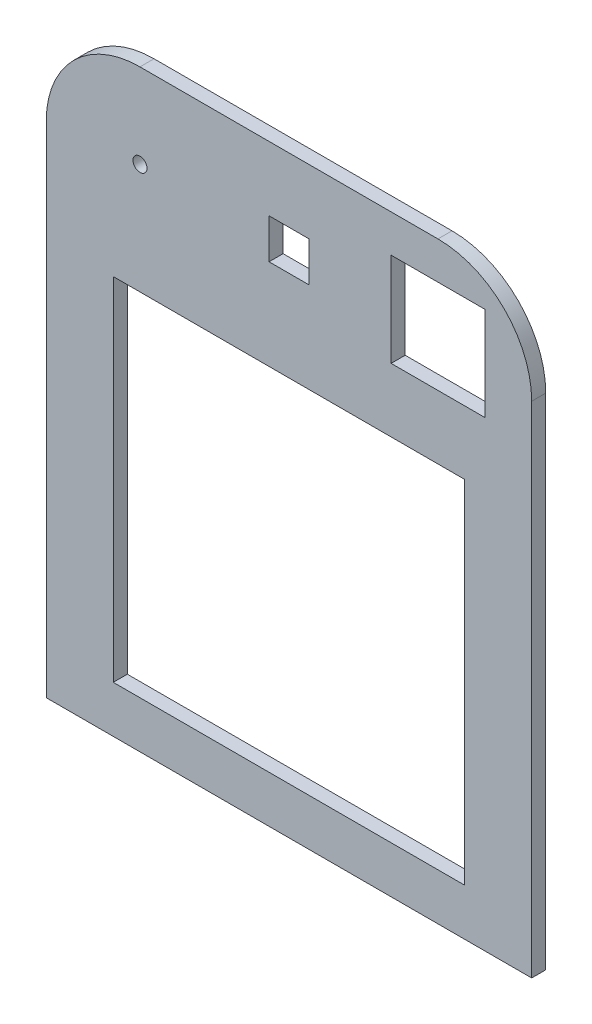
ISO-10303-21;
HEADER;
FILE_DESCRIPTION(('STEP AP214'),'2;1');
FILE_NAME('part.step','',(''),(''),'','','');
FILE_SCHEMA(('AUTOMOTIVE_DESIGN { 1 0 10303 214 1 1 1 1 }'));
ENDSEC;
DATA;
#1=APPLICATION_CONTEXT('core data for automotive mechanical design processes');
#2=APPLICATION_PROTOCOL_DEFINITION('international standard','automotive_design',2000,#1);
#3=PRODUCT_CONTEXT('',#1,'mechanical');
#4=PRODUCT('Part','Part','',(#3));
#5=PRODUCT_RELATED_PRODUCT_CATEGORY('part','',(#4));
#6=PRODUCT_DEFINITION_FORMATION('','',#4);
#7=PRODUCT_DEFINITION_CONTEXT('part definition',#1,'design');
#8=PRODUCT_DEFINITION('design','',#6,#7);
#9=PRODUCT_DEFINITION_SHAPE('','',#8);
#10=(LENGTH_UNIT() NAMED_UNIT(*) SI_UNIT(.MILLI.,.METRE.));
#11=(NAMED_UNIT(*) PLANE_ANGLE_UNIT() SI_UNIT($,.RADIAN.));
#12=(NAMED_UNIT(*) SI_UNIT($,.STERADIAN.) SOLID_ANGLE_UNIT());
#13=UNCERTAINTY_MEASURE_WITH_UNIT(LENGTH_MEASURE(1.E-05),#10,'distance_accuracy_value','');
#14=(GEOMETRIC_REPRESENTATION_CONTEXT(3) GLOBAL_UNCERTAINTY_ASSIGNED_CONTEXT((#13)) GLOBAL_UNIT_ASSIGNED_CONTEXT((#10,
#11,#12)) REPRESENTATION_CONTEXT('',''));
#15=CARTESIAN_POINT('',(0.,0.,0.));
#16=DIRECTION('',(0.,0.,1.));
#17=DIRECTION('',(1.,0.,0.));
#18=AXIS2_PLACEMENT_3D('',#15,#16,#17);
#19=CARTESIAN_POINT('',(51.8,63.3,3.));
#20=DIRECTION('',(-1.,0.,0.));
#21=DIRECTION('',(0.,-1.,0.));
#22=AXIS2_PLACEMENT_3D('',#19,#20,#21);
#23=PLANE('',#22);
#24=DIRECTION('',(0.,1.,0.));
#25=VECTOR('',#24,1.);
#26=CARTESIAN_POINT('',(51.8,63.3,0.));
#27=LINE('',#26,#25);
#28=CARTESIAN_POINT('',(51.8,-63.3,0.));
#29=VERTEX_POINT('',#28);
#30=CARTESIAN_POINT('',(51.8,43.3,0.));
#31=VERTEX_POINT('',#30);
#32=EDGE_CURVE('E203',#29,#31,#27,.T.);
#33=ORIENTED_EDGE('',*,*,#32,.T.);
#34=DIRECTION('',(0.,0.,-1.));
#35=VECTOR('',#34,1.);
#36=CARTESIAN_POINT('',(51.8,43.3,3.));
#37=LINE('',#36,#35);
#38=CARTESIAN_POINT('',(51.8,43.3,3.));
#39=VERTEX_POINT('',#38);
#40=EDGE_CURVE('E304',#31,#39,#37,.F.);
#41=ORIENTED_EDGE('',*,*,#40,.T.);
#42=DIRECTION('',(0.,1.,0.));
#43=VECTOR('',#42,1.);
#44=CARTESIAN_POINT('',(51.8,63.3,3.));
#45=LINE('',#44,#43);
#46=CARTESIAN_POINT('',(51.8,-63.3,3.));
#47=VERTEX_POINT('',#46);
#48=EDGE_CURVE('E276',#47,#39,#45,.T.);
#49=ORIENTED_EDGE('',*,*,#48,.F.);
#50=DIRECTION('',(0.,0.,-1.));
#51=VECTOR('',#50,1.);
#52=CARTESIAN_POINT('',(51.8,-63.3,3.));
#53=LINE('',#52,#51);
#54=EDGE_CURVE('E286',#47,#29,#53,.T.);
#55=ORIENTED_EDGE('',*,*,#54,.T.);
#56=EDGE_LOOP('',(#33,#41,#49,#55));
#57=FACE_BOUND('',#56,.T.);
#58=ADVANCED_FACE('F37',(#57),#23,.F.);
#59=CARTESIAN_POINT('',(-51.8,63.3,3.));
#60=DIRECTION('',(0.,-1.,0.));
#61=DIRECTION('',(0.,0.,-1.));
#62=AXIS2_PLACEMENT_3D('',#59,#60,#61);
#63=PLANE('',#62);
#64=DIRECTION('',(-1.,0.,0.));
#65=VECTOR('',#64,1.);
#66=CARTESIAN_POINT('',(-51.8,63.3,0.));
#67=LINE('',#66,#65);
#68=CARTESIAN_POINT('',(31.8,63.3,0.));
#69=VERTEX_POINT('',#68);
#70=CARTESIAN_POINT('',(-31.8,63.3,0.));
#71=VERTEX_POINT('',#70);
#72=EDGE_CURVE('E289',#69,#71,#67,.T.);
#73=ORIENTED_EDGE('',*,*,#72,.T.);
#74=DIRECTION('',(0.,0.,-1.));
#75=VECTOR('',#74,1.);
#76=CARTESIAN_POINT('',(-31.8,63.3,3.));
#77=LINE('',#76,#75);
#78=CARTESIAN_POINT('',(-31.8,63.3,3.));
#79=VERTEX_POINT('',#78);
#80=EDGE_CURVE('E45',#71,#79,#77,.F.);
#81=ORIENTED_EDGE('',*,*,#80,.T.);
#82=DIRECTION('',(-1.,0.,0.));
#83=VECTOR('',#82,1.);
#84=CARTESIAN_POINT('',(-51.8,63.3,3.));
#85=LINE('',#84,#83);
#86=CARTESIAN_POINT('',(31.8,63.3,3.));
#87=VERTEX_POINT('',#86);
#88=EDGE_CURVE('E279',#87,#79,#85,.T.);
#89=ORIENTED_EDGE('',*,*,#88,.F.);
#90=DIRECTION('',(0.,0.,-1.));
#91=VECTOR('',#90,1.);
#92=CARTESIAN_POINT('',(31.8,63.3,3.));
#93=LINE('',#92,#91);
#94=EDGE_CURVE('E299',#87,#69,#93,.T.);
#95=ORIENTED_EDGE('',*,*,#94,.T.);
#96=EDGE_LOOP('',(#73,#81,#89,#95));
#97=FACE_BOUND('',#96,.T.);
#98=ADVANCED_FACE('F333',(#97),#63,.F.);
#99=CARTESIAN_POINT('',(-51.8,63.3,3.));
#100=DIRECTION('',(1.,0.,0.));
#101=DIRECTION('',(0.,1.,0.));
#102=AXIS2_PLACEMENT_3D('',#99,#100,#101);
#103=PLANE('',#102);
#104=DIRECTION('',(0.,-1.,0.));
#105=VECTOR('',#104,1.);
#106=CARTESIAN_POINT('',(-51.8,63.3,3.));
#107=LINE('',#106,#105);
#108=CARTESIAN_POINT('',(-51.8,43.3,3.));
#109=VERTEX_POINT('',#108);
#110=CARTESIAN_POINT('',(-51.8,-63.3,3.));
#111=VERTEX_POINT('',#110);
#112=EDGE_CURVE('E282',#109,#111,#107,.T.);
#113=ORIENTED_EDGE('',*,*,#112,.F.);
#114=DIRECTION('',(0.,0.,-1.));
#115=VECTOR('',#114,1.);
#116=CARTESIAN_POINT('',(-51.8,43.3,3.));
#117=LINE('',#116,#115);
#118=CARTESIAN_POINT('',(-51.8,43.3,0.));
#119=VERTEX_POINT('',#118);
#120=EDGE_CURVE('E308',#109,#119,#117,.T.);
#121=ORIENTED_EDGE('',*,*,#120,.T.);
#122=DIRECTION('',(0.,-1.,0.));
#123=VECTOR('',#122,1.);
#124=CARTESIAN_POINT('',(-51.8,63.3,0.));
#125=LINE('',#124,#123);
#126=CARTESIAN_POINT('',(-51.8,-63.3,0.));
#127=VERTEX_POINT('',#126);
#128=EDGE_CURVE('E291',#119,#127,#125,.T.);
#129=ORIENTED_EDGE('',*,*,#128,.T.);
#130=DIRECTION('',(0.,0.,-1.));
#131=VECTOR('',#130,1.);
#132=CARTESIAN_POINT('',(-51.8,-63.3,3.));
#133=LINE('',#132,#131);
#134=EDGE_CURVE('E296',#111,#127,#133,.T.);
#135=ORIENTED_EDGE('',*,*,#134,.F.);
#136=EDGE_LOOP('',(#113,#121,#129,#135));
#137=FACE_BOUND('',#136,.T.);
#138=ADVANCED_FACE('F314',(#137),#103,.F.);
#139=CARTESIAN_POINT('',(-51.8,-63.3,3.));
#140=DIRECTION('',(0.,1.,0.));
#141=DIRECTION('',(0.,0.,1.));
#142=AXIS2_PLACEMENT_3D('',#139,#140,#141);
#143=PLANE('',#142);
#144=DIRECTION('',(1.,0.,0.));
#145=VECTOR('',#144,1.);
#146=CARTESIAN_POINT('',(-51.8,-63.3,0.));
#147=LINE('',#146,#145);
#148=EDGE_CURVE('E280',#127,#29,#147,.T.);
#149=ORIENTED_EDGE('',*,*,#148,.T.);
#150=ORIENTED_EDGE('',*,*,#54,.F.);
#151=DIRECTION('',(1.,0.,0.));
#152=VECTOR('',#151,1.);
#153=CARTESIAN_POINT('',(-51.8,-63.3,3.));
#154=LINE('',#153,#152);
#155=EDGE_CURVE('E284',#111,#47,#154,.T.);
#156=ORIENTED_EDGE('',*,*,#155,.F.);
#157=ORIENTED_EDGE('',*,*,#134,.T.);
#158=EDGE_LOOP('',(#149,#150,#156,#157));
#159=FACE_BOUND('',#158,.T.);
#160=ADVANCED_FACE('F322',(#159),#143,.F.);
#161=CARTESIAN_POINT('',(0.,0.,3.));
#162=DIRECTION('',(0.,0.,1.));
#163=DIRECTION('',(1.,0.,0.));
#164=AXIS2_PLACEMENT_3D('',#161,#162,#163);
#165=PLANE('',#164);
#166=DIRECTION('',(-1.,0.,0.));
#167=VECTOR('',#166,1.);
#168=CARTESIAN_POINT('',(37.5,21.7,3.));
#169=LINE('',#168,#167);
#170=CARTESIAN_POINT('',(37.5,21.7,3.));
#171=VERTEX_POINT('',#170);
#172=CARTESIAN_POINT('',(-37.5,21.7,3.));
#173=VERTEX_POINT('',#172);
#174=EDGE_CURVE('E169',#171,#173,#169,.T.);
#175=ORIENTED_EDGE('',*,*,#174,.F.);
#176=DIRECTION('',(0.,1.,0.));
#177=VECTOR('',#176,1.);
#178=CARTESIAN_POINT('',(37.5,-53.3,3.));
#179=LINE('',#178,#177);
#180=CARTESIAN_POINT('',(37.5,-53.3,3.));
#181=VERTEX_POINT('',#180);
#182=EDGE_CURVE('E187',#181,#171,#179,.T.);
#183=ORIENTED_EDGE('',*,*,#182,.F.);
#184=DIRECTION('',(1.,0.,0.));
#185=VECTOR('',#184,1.);
#186=CARTESIAN_POINT('',(-37.5,-53.3,3.));
#187=LINE('',#186,#185);
#188=CARTESIAN_POINT('',(-37.5,-53.3,3.));
#189=VERTEX_POINT('',#188);
#190=EDGE_CURVE('E190',#189,#181,#187,.T.);
#191=ORIENTED_EDGE('',*,*,#190,.F.);
#192=DIRECTION('',(0.,-1.,0.));
#193=VECTOR('',#192,1.);
#194=CARTESIAN_POINT('',(-37.5,21.7,3.));
#195=LINE('',#194,#193);
#196=EDGE_CURVE('E196',#173,#189,#195,.T.);
#197=ORIENTED_EDGE('',*,*,#196,.F.);
#198=EDGE_LOOP('',(#175,#183,#191,#197));
#199=FACE_BOUND('',#198,.T.);
#200=DIRECTION('',(-1.,0.,0.));
#201=VECTOR('',#200,1.);
#202=CARTESIAN_POINT('',(4.25,49.55,3.));
#203=LINE('',#202,#201);
#204=CARTESIAN_POINT('',(4.25,49.55,3.));
#205=VERTEX_POINT('',#204);
#206=CARTESIAN_POINT('',(-4.25,49.55,3.));
#207=VERTEX_POINT('',#206);
#208=EDGE_CURVE('E221',#205,#207,#203,.T.);
#209=ORIENTED_EDGE('',*,*,#208,.F.);
#210=DIRECTION('',(0.,1.,0.));
#211=VECTOR('',#210,1.);
#212=CARTESIAN_POINT('',(4.25,41.05,3.));
#213=LINE('',#212,#211);
#214=CARTESIAN_POINT('',(4.25,41.05,3.));
#215=VERTEX_POINT('',#214);
#216=EDGE_CURVE('E211',#215,#205,#213,.T.);
#217=ORIENTED_EDGE('',*,*,#216,.F.);
#218=DIRECTION('',(1.,0.,0.));
#219=VECTOR('',#218,1.);
#220=CARTESIAN_POINT('',(-4.25,41.05,3.));
#221=LINE('',#220,#219);
#222=CARTESIAN_POINT('',(-4.25,41.05,3.));
#223=VERTEX_POINT('',#222);
#224=EDGE_CURVE('E227',#223,#215,#221,.T.);
#225=ORIENTED_EDGE('',*,*,#224,.F.);
#226=DIRECTION('',(0.,-1.,0.));
#227=VECTOR('',#226,1.);
#228=CARTESIAN_POINT('',(-4.25,49.55,3.));
#229=LINE('',#228,#227);
#230=EDGE_CURVE('E223',#207,#223,#229,.T.);
#231=ORIENTED_EDGE('',*,*,#230,.F.);
#232=EDGE_LOOP('',(#209,#217,#225,#231));
#233=FACE_BOUND('',#232,.T.);
#234=DIRECTION('',(-1.,0.,0.));
#235=VECTOR('',#234,1.);
#236=CARTESIAN_POINT('',(41.8,55.3,3.));
#237=LINE('',#236,#235);
#238=CARTESIAN_POINT('',(41.8,55.3,3.));
#239=VERTEX_POINT('',#238);
#240=CARTESIAN_POINT('',(21.8,55.3,3.));
#241=VERTEX_POINT('',#240);
#242=EDGE_CURVE('E253',#239,#241,#237,.T.);
#243=ORIENTED_EDGE('',*,*,#242,.F.);
#244=DIRECTION('',(0.,1.,0.));
#245=VECTOR('',#244,1.);
#246=CARTESIAN_POINT('',(41.8,35.3,3.));
#247=LINE('',#246,#245);
#248=CARTESIAN_POINT('',(41.8,35.3,3.));
#249=VERTEX_POINT('',#248);
#250=EDGE_CURVE('E243',#249,#239,#247,.T.);
#251=ORIENTED_EDGE('',*,*,#250,.F.);
#252=DIRECTION('',(1.,0.,0.));
#253=VECTOR('',#252,1.);
#254=CARTESIAN_POINT('',(21.8,35.3,3.));
#255=LINE('',#254,#253);
#256=CARTESIAN_POINT('',(21.8,35.3,3.));
#257=VERTEX_POINT('',#256);
#258=EDGE_CURVE('E259',#257,#249,#255,.T.);
#259=ORIENTED_EDGE('',*,*,#258,.F.);
#260=DIRECTION('',(0.,-1.,0.));
#261=VECTOR('',#260,1.);
#262=CARTESIAN_POINT('',(21.8,55.3,3.));
#263=LINE('',#262,#261);
#264=EDGE_CURVE('E255',#241,#257,#263,.T.);
#265=ORIENTED_EDGE('',*,*,#264,.F.);
#266=EDGE_LOOP('',(#243,#251,#259,#265));
#267=FACE_BOUND('',#266,.T.);
#268=CARTESIAN_POINT('',(-31.8,45.3,3.));
#269=DIRECTION('',(0.,0.,1.));
#270=DIRECTION('',(1.,0.,0.));
#271=AXIS2_PLACEMENT_3D('',#268,#269,#270);
#272=CIRCLE('',#271,1.5);
#273=CARTESIAN_POINT('',(-30.3,45.3,3.));
#274=VERTEX_POINT('',#273);
#275=EDGE_CURVE('E273',#274,#274,#272,.T.);
#276=ORIENTED_EDGE('',*,*,#275,.F.);
#277=EDGE_LOOP('',(#276));
#278=FACE_BOUND('',#277,.T.);
#279=ORIENTED_EDGE('',*,*,#88,.T.);
#280=CARTESIAN_POINT('',(-31.8,43.3,3.));
#281=DIRECTION('',(0.,0.,1.));
#282=DIRECTION('',(1.,0.,0.));
#283=AXIS2_PLACEMENT_3D('',#280,#281,#282);
#284=CIRCLE('',#283,20.);
#285=EDGE_CURVE('E11',#79,#109,#284,.T.);
#286=ORIENTED_EDGE('',*,*,#285,.T.);
#287=ORIENTED_EDGE('',*,*,#112,.T.);
#288=ORIENTED_EDGE('',*,*,#155,.T.);
#289=ORIENTED_EDGE('',*,*,#48,.T.);
#290=CARTESIAN_POINT('',(31.8,43.3,3.));
#291=DIRECTION('',(0.,0.,1.));
#292=DIRECTION('',(1.,0.,0.));
#293=AXIS2_PLACEMENT_3D('',#290,#291,#292);
#294=CIRCLE('',#293,20.);
#295=EDGE_CURVE('E306',#39,#87,#294,.T.);
#296=ORIENTED_EDGE('',*,*,#295,.T.);
#297=EDGE_LOOP('',(#279,#286,#287,#288,#289,#296));
#298=FACE_BOUND('',#297,.T.);
#299=ADVANCED_FACE('F329',(#199,#233,#267,#278,#298),#165,.T.);
#300=CARTESIAN_POINT('',(0.,0.,0.));
#301=DIRECTION('',(0.,0.,1.));
#302=DIRECTION('',(1.,0.,0.));
#303=AXIS2_PLACEMENT_3D('',#300,#301,#302);
#304=PLANE('',#303);
#305=DIRECTION('',(0.,1.,0.));
#306=VECTOR('',#305,1.);
#307=CARTESIAN_POINT('',(37.5,-53.3,0.));
#308=LINE('',#307,#306);
#309=CARTESIAN_POINT('',(37.5,-53.3,0.));
#310=VERTEX_POINT('',#309);
#311=CARTESIAN_POINT('',(37.5,21.7,0.));
#312=VERTEX_POINT('',#311);
#313=EDGE_CURVE('E174',#310,#312,#308,.T.);
#314=ORIENTED_EDGE('',*,*,#313,.T.);
#315=DIRECTION('',(-1.,0.,0.));
#316=VECTOR('',#315,1.);
#317=CARTESIAN_POINT('',(37.5,21.7,0.));
#318=LINE('',#317,#316);
#319=CARTESIAN_POINT('',(-37.5,21.7,0.));
#320=VERTEX_POINT('',#319);
#321=EDGE_CURVE('E166',#312,#320,#318,.T.);
#322=ORIENTED_EDGE('',*,*,#321,.T.);
#323=DIRECTION('',(0.,-1.,0.));
#324=VECTOR('',#323,1.);
#325=CARTESIAN_POINT('',(-37.5,21.7,0.));
#326=LINE('',#325,#324);
#327=CARTESIAN_POINT('',(-37.5,-53.3,0.));
#328=VERTEX_POINT('',#327);
#329=EDGE_CURVE('E178',#320,#328,#326,.T.);
#330=ORIENTED_EDGE('',*,*,#329,.T.);
#331=DIRECTION('',(1.,0.,0.));
#332=VECTOR('',#331,1.);
#333=CARTESIAN_POINT('',(-37.5,-53.3,0.));
#334=LINE('',#333,#332);
#335=EDGE_CURVE('E182',#328,#310,#334,.T.);
#336=ORIENTED_EDGE('',*,*,#335,.T.);
#337=EDGE_LOOP('',(#314,#322,#330,#336));
#338=FACE_BOUND('',#337,.T.);
#339=DIRECTION('',(0.,1.,0.));
#340=VECTOR('',#339,1.);
#341=CARTESIAN_POINT('',(4.25,41.05,0.));
#342=LINE('',#341,#340);
#343=CARTESIAN_POINT('',(4.25,41.05,0.));
#344=VERTEX_POINT('',#343);
#345=CARTESIAN_POINT('',(4.25,49.55,0.));
#346=VERTEX_POINT('',#345);
#347=EDGE_CURVE('E217',#344,#346,#342,.T.);
#348=ORIENTED_EDGE('',*,*,#347,.T.);
#349=DIRECTION('',(-1.,0.,0.));
#350=VECTOR('',#349,1.);
#351=CARTESIAN_POINT('',(4.25,49.55,0.));
#352=LINE('',#351,#350);
#353=CARTESIAN_POINT('',(-4.25,49.55,0.));
#354=VERTEX_POINT('',#353);
#355=EDGE_CURVE('E207',#346,#354,#352,.T.);
#356=ORIENTED_EDGE('',*,*,#355,.T.);
#357=DIRECTION('',(0.,-1.,0.));
#358=VECTOR('',#357,1.);
#359=CARTESIAN_POINT('',(-4.25,49.55,0.));
#360=LINE('',#359,#358);
#361=CARTESIAN_POINT('',(-4.25,41.05,0.));
#362=VERTEX_POINT('',#361);
#363=EDGE_CURVE('E210',#354,#362,#360,.T.);
#364=ORIENTED_EDGE('',*,*,#363,.T.);
#365=DIRECTION('',(1.,0.,0.));
#366=VECTOR('',#365,1.);
#367=CARTESIAN_POINT('',(-4.25,41.05,0.));
#368=LINE('',#367,#366);
#369=EDGE_CURVE('E214',#362,#344,#368,.T.);
#370=ORIENTED_EDGE('',*,*,#369,.T.);
#371=EDGE_LOOP('',(#348,#356,#364,#370));
#372=FACE_BOUND('',#371,.T.);
#373=DIRECTION('',(0.,1.,0.));
#374=VECTOR('',#373,1.);
#375=CARTESIAN_POINT('',(41.8,35.3,0.));
#376=LINE('',#375,#374);
#377=CARTESIAN_POINT('',(41.8,35.3,0.));
#378=VERTEX_POINT('',#377);
#379=CARTESIAN_POINT('',(41.8,55.3,0.));
#380=VERTEX_POINT('',#379);
#381=EDGE_CURVE('E249',#378,#380,#376,.T.);
#382=ORIENTED_EDGE('',*,*,#381,.T.);
#383=DIRECTION('',(-1.,0.,0.));
#384=VECTOR('',#383,1.);
#385=CARTESIAN_POINT('',(41.8,55.3,0.));
#386=LINE('',#385,#384);
#387=CARTESIAN_POINT('',(21.8,55.3,0.));
#388=VERTEX_POINT('',#387);
#389=EDGE_CURVE('E239',#380,#388,#386,.T.);
#390=ORIENTED_EDGE('',*,*,#389,.T.);
#391=DIRECTION('',(0.,-1.,0.));
#392=VECTOR('',#391,1.);
#393=CARTESIAN_POINT('',(21.8,55.3,0.));
#394=LINE('',#393,#392);
#395=CARTESIAN_POINT('',(21.8,35.3,0.));
#396=VERTEX_POINT('',#395);
#397=EDGE_CURVE('E242',#388,#396,#394,.T.);
#398=ORIENTED_EDGE('',*,*,#397,.T.);
#399=DIRECTION('',(1.,0.,0.));
#400=VECTOR('',#399,1.);
#401=CARTESIAN_POINT('',(21.8,35.3,0.));
#402=LINE('',#401,#400);
#403=EDGE_CURVE('E246',#396,#378,#402,.T.);
#404=ORIENTED_EDGE('',*,*,#403,.T.);
#405=EDGE_LOOP('',(#382,#390,#398,#404));
#406=FACE_BOUND('',#405,.T.);
#407=CARTESIAN_POINT('',(-31.8,45.3,0.));
#408=DIRECTION('',(0.,0.,1.));
#409=DIRECTION('',(1.,0.,0.));
#410=AXIS2_PLACEMENT_3D('',#407,#408,#409);
#411=CIRCLE('',#410,1.5);
#412=CARTESIAN_POINT('',(-30.3,45.3,0.));
#413=VERTEX_POINT('',#412);
#414=EDGE_CURVE('E256',#413,#413,#411,.T.);
#415=ORIENTED_EDGE('',*,*,#414,.T.);
#416=EDGE_LOOP('',(#415));
#417=FACE_BOUND('',#416,.T.);
#418=ORIENTED_EDGE('',*,*,#128,.F.);
#419=CARTESIAN_POINT('',(-31.8,43.3,0.));
#420=DIRECTION('',(0.,0.,1.));
#421=DIRECTION('',(1.,0.,0.));
#422=AXIS2_PLACEMENT_3D('',#419,#420,#421);
#423=CIRCLE('',#422,20.);
#424=EDGE_CURVE('E59',#119,#71,#423,.F.);
#425=ORIENTED_EDGE('',*,*,#424,.T.);
#426=ORIENTED_EDGE('',*,*,#72,.F.);
#427=CARTESIAN_POINT('',(31.8,43.3,0.));
#428=DIRECTION('',(0.,0.,1.));
#429=DIRECTION('',(1.,0.,0.));
#430=AXIS2_PLACEMENT_3D('',#427,#428,#429);
#431=CIRCLE('',#430,20.);
#432=EDGE_CURVE('E302',#69,#31,#431,.F.);
#433=ORIENTED_EDGE('',*,*,#432,.T.);
#434=ORIENTED_EDGE('',*,*,#32,.F.);
#435=ORIENTED_EDGE('',*,*,#148,.F.);
#436=EDGE_LOOP('',(#418,#425,#426,#433,#434,#435));
#437=FACE_BOUND('',#436,.T.);
#438=ADVANCED_FACE('F184',(#338,#372,#406,#417,#437),#304,.F.);
#439=CARTESIAN_POINT('',(-31.8,45.3,0.));
#440=DIRECTION('',(0.,0.,1.));
#441=DIRECTION('',(1.,0.,0.));
#442=AXIS2_PLACEMENT_3D('',#439,#440,#441);
#443=CYLINDRICAL_SURFACE('',#442,1.5);
#444=ORIENTED_EDGE('',*,*,#414,.F.);
#445=EDGE_LOOP('',(#444));
#446=FACE_BOUND('',#445,.T.);
#447=ORIENTED_EDGE('',*,*,#275,.T.);
#448=EDGE_LOOP('',(#447));
#449=FACE_BOUND('',#448,.T.);
#450=ADVANCED_FACE('F351',(#446,#449),#443,.F.);
#451=CARTESIAN_POINT('',(41.8,55.3,0.));
#452=DIRECTION('',(0.,1.,0.));
#453=DIRECTION('',(-1.,0.,0.));
#454=AXIS2_PLACEMENT_3D('',#451,#452,#453);
#455=PLANE('',#454);
#456=ORIENTED_EDGE('',*,*,#242,.T.);
#457=DIRECTION('',(0.,0.,1.));
#458=VECTOR('',#457,1.);
#459=CARTESIAN_POINT('',(21.8,55.3,0.));
#460=LINE('',#459,#458);
#461=EDGE_CURVE('E252',#388,#241,#460,.T.);
#462=ORIENTED_EDGE('',*,*,#461,.F.);
#463=ORIENTED_EDGE('',*,*,#389,.F.);
#464=DIRECTION('',(0.,0.,1.));
#465=VECTOR('',#464,1.);
#466=CARTESIAN_POINT('',(41.8,55.3,0.));
#467=LINE('',#466,#465);
#468=EDGE_CURVE('E224',#380,#239,#467,.T.);
#469=ORIENTED_EDGE('',*,*,#468,.T.);
#470=EDGE_LOOP('',(#456,#462,#463,#469));
#471=FACE_BOUND('',#470,.T.);
#472=ADVANCED_FACE('F357',(#471),#455,.F.);
#473=CARTESIAN_POINT('',(41.8,35.3,0.));
#474=DIRECTION('',(1.,0.,0.));
#475=DIRECTION('',(0.,0.,-1.));
#476=AXIS2_PLACEMENT_3D('',#473,#474,#475);
#477=PLANE('',#476);
#478=ORIENTED_EDGE('',*,*,#250,.T.);
#479=ORIENTED_EDGE('',*,*,#468,.F.);
#480=ORIENTED_EDGE('',*,*,#381,.F.);
#481=DIRECTION('',(0.,0.,1.));
#482=VECTOR('',#481,1.);
#483=CARTESIAN_POINT('',(41.8,35.3,0.));
#484=LINE('',#483,#482);
#485=EDGE_CURVE('E265',#378,#249,#484,.T.);
#486=ORIENTED_EDGE('',*,*,#485,.T.);
#487=EDGE_LOOP('',(#478,#479,#480,#486));
#488=FACE_BOUND('',#487,.T.);
#489=ADVANCED_FACE('F361',(#488),#477,.F.);
#490=CARTESIAN_POINT('',(21.8,35.3,0.));
#491=DIRECTION('',(0.,-1.,0.));
#492=DIRECTION('',(0.,0.,-1.));
#493=AXIS2_PLACEMENT_3D('',#490,#491,#492);
#494=PLANE('',#493);
#495=ORIENTED_EDGE('',*,*,#258,.T.);
#496=ORIENTED_EDGE('',*,*,#485,.F.);
#497=ORIENTED_EDGE('',*,*,#403,.F.);
#498=DIRECTION('',(0.,0.,1.));
#499=VECTOR('',#498,1.);
#500=CARTESIAN_POINT('',(21.8,35.3,0.));
#501=LINE('',#500,#499);
#502=EDGE_CURVE('E267',#396,#257,#501,.T.);
#503=ORIENTED_EDGE('',*,*,#502,.T.);
#504=EDGE_LOOP('',(#495,#496,#497,#503));
#505=FACE_BOUND('',#504,.T.);
#506=ADVANCED_FACE('F367',(#505),#494,.F.);
#507=CARTESIAN_POINT('',(21.8,55.3,0.));
#508=DIRECTION('',(-1.,0.,0.));
#509=DIRECTION('',(0.,0.,1.));
#510=AXIS2_PLACEMENT_3D('',#507,#508,#509);
#511=PLANE('',#510);
#512=ORIENTED_EDGE('',*,*,#264,.T.);
#513=ORIENTED_EDGE('',*,*,#502,.F.);
#514=ORIENTED_EDGE('',*,*,#397,.F.);
#515=ORIENTED_EDGE('',*,*,#461,.T.);
#516=EDGE_LOOP('',(#512,#513,#514,#515));
#517=FACE_BOUND('',#516,.T.);
#518=ADVANCED_FACE('F363',(#517),#511,.F.);
#519=CARTESIAN_POINT('',(4.25,49.55,0.));
#520=DIRECTION('',(0.,1.,0.));
#521=DIRECTION('',(0.,0.,1.));
#522=AXIS2_PLACEMENT_3D('',#519,#520,#521);
#523=PLANE('',#522);
#524=ORIENTED_EDGE('',*,*,#208,.T.);
#525=DIRECTION('',(0.,0.,1.));
#526=VECTOR('',#525,1.);
#527=CARTESIAN_POINT('',(-4.25,49.55,0.));
#528=LINE('',#527,#526);
#529=EDGE_CURVE('E220',#354,#207,#528,.T.);
#530=ORIENTED_EDGE('',*,*,#529,.F.);
#531=ORIENTED_EDGE('',*,*,#355,.F.);
#532=DIRECTION('',(0.,0.,1.));
#533=VECTOR('',#532,1.);
#534=CARTESIAN_POINT('',(4.25,49.55,0.));
#535=LINE('',#534,#533);
#536=EDGE_CURVE('E197',#346,#205,#535,.T.);
#537=ORIENTED_EDGE('',*,*,#536,.T.);
#538=EDGE_LOOP('',(#524,#530,#531,#537));
#539=FACE_BOUND('',#538,.T.);
#540=ADVANCED_FACE('F366',(#539),#523,.F.);
#541=CARTESIAN_POINT('',(4.25,41.05,0.));
#542=DIRECTION('',(1.,0.,0.));
#543=DIRECTION('',(0.,1.,0.));
#544=AXIS2_PLACEMENT_3D('',#541,#542,#543);
#545=PLANE('',#544);
#546=ORIENTED_EDGE('',*,*,#216,.T.);
#547=ORIENTED_EDGE('',*,*,#536,.F.);
#548=ORIENTED_EDGE('',*,*,#347,.F.);
#549=DIRECTION('',(0.,0.,1.));
#550=VECTOR('',#549,1.);
#551=CARTESIAN_POINT('',(4.25,41.05,0.));
#552=LINE('',#551,#550);
#553=EDGE_CURVE('E233',#344,#215,#552,.T.);
#554=ORIENTED_EDGE('',*,*,#553,.T.);
#555=EDGE_LOOP('',(#546,#547,#548,#554));
#556=FACE_BOUND('',#555,.T.);
#557=ADVANCED_FACE('F377',(#556),#545,.F.);
#558=CARTESIAN_POINT('',(-4.25,41.05,0.));
#559=DIRECTION('',(0.,-1.,0.));
#560=DIRECTION('',(0.,0.,-1.));
#561=AXIS2_PLACEMENT_3D('',#558,#559,#560);
#562=PLANE('',#561);
#563=ORIENTED_EDGE('',*,*,#224,.T.);
#564=ORIENTED_EDGE('',*,*,#553,.F.);
#565=ORIENTED_EDGE('',*,*,#369,.F.);
#566=DIRECTION('',(0.,0.,1.));
#567=VECTOR('',#566,1.);
#568=CARTESIAN_POINT('',(-4.25,41.05,0.));
#569=LINE('',#568,#567);
#570=EDGE_CURVE('E235',#362,#223,#569,.T.);
#571=ORIENTED_EDGE('',*,*,#570,.T.);
#572=EDGE_LOOP('',(#563,#564,#565,#571));
#573=FACE_BOUND('',#572,.T.);
#574=ADVANCED_FACE('F382',(#573),#562,.F.);
#575=CARTESIAN_POINT('',(-4.25,49.55,0.));
#576=DIRECTION('',(-1.,0.,0.));
#577=DIRECTION('',(0.,-1.,0.));
#578=AXIS2_PLACEMENT_3D('',#575,#576,#577);
#579=PLANE('',#578);
#580=ORIENTED_EDGE('',*,*,#230,.T.);
#581=ORIENTED_EDGE('',*,*,#570,.F.);
#582=ORIENTED_EDGE('',*,*,#363,.F.);
#583=ORIENTED_EDGE('',*,*,#529,.T.);
#584=EDGE_LOOP('',(#580,#581,#582,#583));
#585=FACE_BOUND('',#584,.T.);
#586=ADVANCED_FACE('F379',(#585),#579,.F.);
#587=CARTESIAN_POINT('',(37.5,21.7,0.));
#588=DIRECTION('',(0.,1.,0.));
#589=DIRECTION('',(-1.,0.,0.));
#590=AXIS2_PLACEMENT_3D('',#587,#588,#589);
#591=PLANE('',#590);
#592=ORIENTED_EDGE('',*,*,#174,.T.);
#593=DIRECTION('',(0.,0.,1.));
#594=VECTOR('',#593,1.);
#595=CARTESIAN_POINT('',(-37.5,21.7,0.));
#596=LINE('',#595,#594);
#597=EDGE_CURVE('E162',#320,#173,#596,.T.);
#598=ORIENTED_EDGE('',*,*,#597,.F.);
#599=ORIENTED_EDGE('',*,*,#321,.F.);
#600=DIRECTION('',(0.,0.,1.));
#601=VECTOR('',#600,1.);
#602=CARTESIAN_POINT('',(37.5,21.7,0.));
#603=LINE('',#602,#601);
#604=EDGE_CURVE('E201',#312,#171,#603,.T.);
#605=ORIENTED_EDGE('',*,*,#604,.T.);
#606=EDGE_LOOP('',(#592,#598,#599,#605));
#607=FACE_BOUND('',#606,.T.);
#608=ADVANCED_FACE('F164',(#607),#591,.F.);
#609=CARTESIAN_POINT('',(37.5,-53.3,0.));
#610=DIRECTION('',(1.,0.,0.));
#611=DIRECTION('',(0.,1.,0.));
#612=AXIS2_PLACEMENT_3D('',#609,#610,#611);
#613=PLANE('',#612);
#614=ORIENTED_EDGE('',*,*,#182,.T.);
#615=ORIENTED_EDGE('',*,*,#604,.F.);
#616=ORIENTED_EDGE('',*,*,#313,.F.);
#617=DIRECTION('',(0.,0.,1.));
#618=VECTOR('',#617,1.);
#619=CARTESIAN_POINT('',(37.5,-53.3,0.));
#620=LINE('',#619,#618);
#621=EDGE_CURVE('E204',#310,#181,#620,.T.);
#622=ORIENTED_EDGE('',*,*,#621,.T.);
#623=EDGE_LOOP('',(#614,#615,#616,#622));
#624=FACE_BOUND('',#623,.T.);
#625=ADVANCED_FACE('F392',(#624),#613,.F.);
#626=CARTESIAN_POINT('',(-37.5,-53.3,0.));
#627=DIRECTION('',(0.,-1.,0.));
#628=DIRECTION('',(0.,0.,-1.));
#629=AXIS2_PLACEMENT_3D('',#626,#627,#628);
#630=PLANE('',#629);
#631=ORIENTED_EDGE('',*,*,#190,.T.);
#632=ORIENTED_EDGE('',*,*,#621,.F.);
#633=ORIENTED_EDGE('',*,*,#335,.F.);
#634=DIRECTION('',(0.,0.,1.));
#635=VECTOR('',#634,1.);
#636=CARTESIAN_POINT('',(-37.5,-53.3,0.));
#637=LINE('',#636,#635);
#638=EDGE_CURVE('E173',#328,#189,#637,.T.);
#639=ORIENTED_EDGE('',*,*,#638,.T.);
#640=EDGE_LOOP('',(#631,#632,#633,#639));
#641=FACE_BOUND('',#640,.T.);
#642=ADVANCED_FACE('F395',(#641),#630,.F.);
#643=CARTESIAN_POINT('',(-37.5,21.7,0.));
#644=DIRECTION('',(-1.,0.,0.));
#645=DIRECTION('',(0.,-1.,0.));
#646=AXIS2_PLACEMENT_3D('',#643,#644,#645);
#647=PLANE('',#646);
#648=ORIENTED_EDGE('',*,*,#196,.T.);
#649=ORIENTED_EDGE('',*,*,#638,.F.);
#650=ORIENTED_EDGE('',*,*,#329,.F.);
#651=ORIENTED_EDGE('',*,*,#597,.T.);
#652=EDGE_LOOP('',(#648,#649,#650,#651));
#653=FACE_BOUND('',#652,.T.);
#654=ADVANCED_FACE('F179',(#653),#647,.F.);
#655=CARTESIAN_POINT('',(31.8,43.3,3.));
#656=DIRECTION('',(0.,0.,-1.));
#657=DIRECTION('',(-1.,0.,0.));
#658=AXIS2_PLACEMENT_3D('',#655,#656,#657);
#659=CYLINDRICAL_SURFACE('',#658,20.);
#660=ORIENTED_EDGE('',*,*,#295,.F.);
#661=ORIENTED_EDGE('',*,*,#40,.F.);
#662=ORIENTED_EDGE('',*,*,#432,.F.);
#663=ORIENTED_EDGE('',*,*,#94,.F.);
#664=EDGE_LOOP('',(#660,#661,#662,#663));
#665=FACE_BOUND('',#664,.T.);
#666=ADVANCED_FACE('F332',(#665),#659,.T.);
#667=CARTESIAN_POINT('',(-31.8,43.3,3.));
#668=DIRECTION('',(0.,0.,-1.));
#669=DIRECTION('',(-1.,0.,0.));
#670=AXIS2_PLACEMENT_3D('',#667,#668,#669);
#671=CYLINDRICAL_SURFACE('',#670,20.);
#672=ORIENTED_EDGE('',*,*,#285,.F.);
#673=ORIENTED_EDGE('',*,*,#80,.F.);
#674=ORIENTED_EDGE('',*,*,#424,.F.);
#675=ORIENTED_EDGE('',*,*,#120,.F.);
#676=EDGE_LOOP('',(#672,#673,#674,#675));
#677=FACE_BOUND('',#676,.T.);
#678=ADVANCED_FACE('F39',(#677),#671,.T.);
#679=CLOSED_SHELL('',(#58,#98,#138,#160,#299,#438,#450,#472,#489,#506,#518,#540,#557,#574,#586,
#608,#625,#642,#654,#666,#678));
#680=MANIFOLD_SOLID_BREP('B2',#679);
#681=ADVANCED_BREP_SHAPE_REPRESENTATION('',(#18,#680),#14);
#682=SHAPE_DEFINITION_REPRESENTATION(#9,#681);
ENDSEC;
END-ISO-10303-21;
